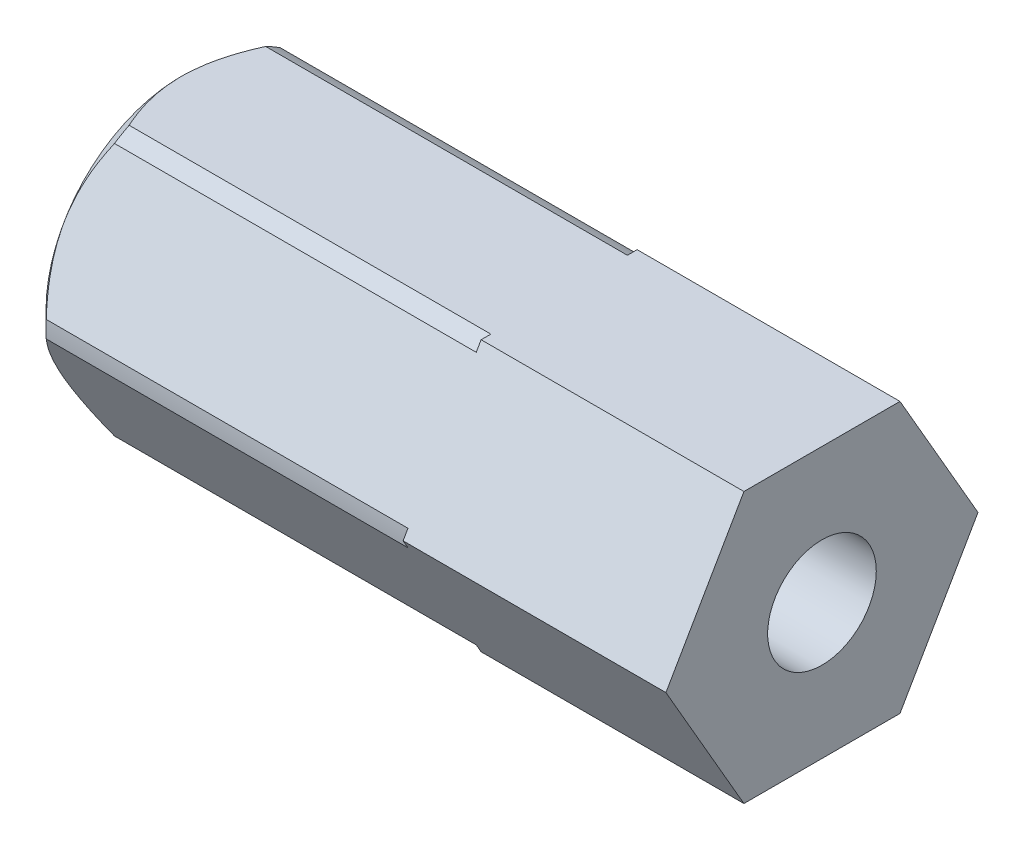
ISO-10303-21;
HEADER;
FILE_DESCRIPTION(('STEP AP214'),'2;1');
FILE_NAME('part.step','',(''),(''),'','','');
FILE_SCHEMA(('AUTOMOTIVE_DESIGN { 1 0 10303 214 1 1 1 1 }'));
ENDSEC;
DATA;
#1=APPLICATION_CONTEXT('core data for automotive mechanical design processes');
#2=APPLICATION_PROTOCOL_DEFINITION('international standard','automotive_design',2000,#1);
#3=PRODUCT_CONTEXT('',#1,'mechanical');
#4=PRODUCT('Part','Part','',(#3));
#5=PRODUCT_RELATED_PRODUCT_CATEGORY('part','',(#4));
#6=PRODUCT_DEFINITION_FORMATION('','',#4);
#7=PRODUCT_DEFINITION_CONTEXT('part definition',#1,'design');
#8=PRODUCT_DEFINITION('design','',#6,#7);
#9=PRODUCT_DEFINITION_SHAPE('','',#8);
#10=(LENGTH_UNIT() NAMED_UNIT(*) SI_UNIT(.MILLI.,.METRE.));
#11=(NAMED_UNIT(*) PLANE_ANGLE_UNIT() SI_UNIT($,.RADIAN.));
#12=(NAMED_UNIT(*) SI_UNIT($,.STERADIAN.) SOLID_ANGLE_UNIT());
#13=UNCERTAINTY_MEASURE_WITH_UNIT(LENGTH_MEASURE(1.E-05),#10,'distance_accuracy_value','');
#14=(GEOMETRIC_REPRESENTATION_CONTEXT(3) GLOBAL_UNCERTAINTY_ASSIGNED_CONTEXT((#13)) GLOBAL_UNIT_ASSIGNED_CONTEXT((#10,
#11,#12)) REPRESENTATION_CONTEXT('',''));
#15=CARTESIAN_POINT('',(0.,0.,0.));
#16=DIRECTION('',(0.,0.,1.));
#17=DIRECTION('',(1.,0.,0.));
#18=AXIS2_PLACEMENT_3D('',#15,#16,#17);
#19=CARTESIAN_POINT('',(-19.4400000000314,0.,0.));
#20=DIRECTION('',(-1.,0.,0.));
#21=DIRECTION('',(0.,0.,1.));
#22=AXIS2_PLACEMENT_3D('',#19,#20,#21);
#23=CONICAL_SURFACE('',#22,3.74999999996817,1.029744258673);
#24=CARTESIAN_POINT('',(-17.1867726786843,0.,5.6843418860808E-11));
#25=VERTEX_POINT('',#24);
#26=VERTEX_LOOP('',#25);
#27=FACE_BOUND('',#26,.T.);
#28=CARTESIAN_POINT('',(-19.44,0.,0.));
#29=DIRECTION('',(-1.,0.,0.));
#30=DIRECTION('',(0.,0.,1.));
#31=AXIS2_PLACEMENT_3D('',#28,#29,#30);
#32=CIRCLE('',#31,3.75);
#33=CARTESIAN_POINT('',(-19.44,0.,3.75));
#34=VERTEX_POINT('',#33);
#35=EDGE_CURVE('E236',#34,#34,#32,.T.);
#36=ORIENTED_EDGE('',*,*,#35,.T.);
#37=EDGE_LOOP('',(#36));
#38=FACE_BOUND('',#37,.T.);
#39=ADVANCED_FACE('F17',(#27,#38),#23,.F.);
#40=CARTESIAN_POINT('',(-27.94,0.,0.));
#41=DIRECTION('',(-1.,0.,0.));
#42=DIRECTION('',(0.,0.,1.));
#43=AXIS2_PLACEMENT_3D('',#40,#41,#42);
#44=CYLINDRICAL_SURFACE('',#43,3.75);
#45=ORIENTED_EDGE('',*,*,#35,.F.);
#46=EDGE_LOOP('',(#45));
#47=FACE_BOUND('',#46,.T.);
#48=CARTESIAN_POINT('',(-27.6900000000069,0.,0.));
#49=DIRECTION('',(-1.,0.,0.));
#50=DIRECTION('',(0.,-1.,0.));
#51=AXIS2_PLACEMENT_3D('',#48,#49,#50);
#52=CIRCLE('',#51,3.74999999996817);
#53=CARTESIAN_POINT('',(-27.6900000000069,-3.74999999996817,0.));
#54=VERTEX_POINT('',#53);
#55=EDGE_CURVE('E156',#54,#54,#52,.T.);
#56=ORIENTED_EDGE('',*,*,#55,.T.);
#57=EDGE_LOOP('',(#56));
#58=FACE_BOUND('',#57,.T.);
#59=ADVANCED_FACE('F339',(#47,#58),#44,.F.);
#60=CARTESIAN_POINT('',(-27.940000000001,0.,0.));
#61=DIRECTION('',(-1.,0.,0.));
#62=DIRECTION('',(0.,-1.,0.));
#63=AXIS2_PLACEMENT_3D('',#60,#61,#62);
#64=CONICAL_SURFACE('',#63,3.99999999996226,0.785398163397448);
#65=ORIENTED_EDGE('',*,*,#55,.F.);
#66=EDGE_LOOP('',(#65));
#67=FACE_BOUND('',#66,.T.);
#68=CARTESIAN_POINT('',(-27.940000000001,0.,0.));
#69=DIRECTION('',(-1.,0.,0.));
#70=DIRECTION('',(0.,-1.,0.));
#71=AXIS2_PLACEMENT_3D('',#68,#69,#70);
#72=CIRCLE('',#71,3.99999999996226);
#73=CARTESIAN_POINT('',(-27.940000000001,-3.99999999996226,0.));
#74=VERTEX_POINT('',#73);
#75=EDGE_CURVE('E220',#74,#74,#72,.T.);
#76=ORIENTED_EDGE('',*,*,#75,.T.);
#77=EDGE_LOOP('',(#76));
#78=FACE_BOUND('',#77,.T.);
#79=ADVANCED_FACE('F336',(#67,#78),#64,.F.);
#80=CARTESIAN_POINT('',(-10.5092499493935,0.,0.));
#81=DIRECTION('',(1.,0.,0.));
#82=DIRECTION('',(0.,0.,-1.));
#83=AXIS2_PLACEMENT_3D('',#80,#81,#82);
#84=CONICAL_SURFACE('',#83,2.55269999991015,1.02974425857637);
#85=CARTESIAN_POINT('',(-12.0430668516178,0.,-3.41060513164848E-10));
#86=VERTEX_POINT('',#85);
#87=VERTEX_LOOP('',#86);
#88=FACE_BOUND('',#87,.T.);
#89=CARTESIAN_POINT('',(-10.5092499493319,0.,0.));
#90=DIRECTION('',(1.,0.,0.));
#91=DIRECTION('',(0.,0.,-1.));
#92=AXIS2_PLACEMENT_3D('',#89,#90,#91);
#93=CIRCLE('',#92,2.55269999999999);
#94=CARTESIAN_POINT('',(-10.5092499493319,0.,-2.55269999999999));
#95=VERTEX_POINT('',#94);
#96=EDGE_CURVE('E192',#95,#95,#93,.T.);
#97=ORIENTED_EDGE('',*,*,#96,.T.);
#98=EDGE_LOOP('',(#97));
#99=FACE_BOUND('',#98,.T.);
#100=ADVANCED_FACE('F333',(#88,#99),#84,.F.);
#101=CARTESIAN_POINT('',(-10.16,0.,0.));
#102=DIRECTION('',(-1.,0.,0.));
#103=DIRECTION('',(0.,0.,1.));
#104=AXIS2_PLACEMENT_3D('',#101,#102,#103);
#105=PLANE('',#104);
#106=DIRECTION('',(0.,-0.866025403784439,-0.5));
#107=VECTOR('',#106,1.);
#108=CARTESIAN_POINT('',(-10.16,0.,-7.33234841870825));
#109=LINE('',#108,#107);
#110=CARTESIAN_POINT('',(-10.16,6.35000000000001,-3.66617420935411));
#111=VERTEX_POINT('',#110);
#112=CARTESIAN_POINT('',(-10.16,5.953125,-3.89531009743875));
#113=VERTEX_POINT('',#112);
#114=EDGE_CURVE('E150',#111,#113,#109,.T.);
#115=ORIENTED_EDGE('',*,*,#114,.T.);
#116=CARTESIAN_POINT('',(-10.16,0.,0.));
#117=DIRECTION('',(-1.,0.,0.));
#118=DIRECTION('',(0.,0.,1.));
#119=AXIS2_PLACEMENT_3D('',#116,#117,#118);
#120=CIRCLE('',#119,7.11429111161704);
#121=CARTESIAN_POINT('',(-10.16,6.35000000000001,-3.20790243318483));
#122=VERTEX_POINT('',#121);
#123=EDGE_CURVE('E20',#122,#113,#120,.T.);
#124=ORIENTED_EDGE('',*,*,#123,.F.);
#125=DIRECTION('',(0.,0.,-1.));
#126=VECTOR('',#125,1.);
#127=CARTESIAN_POINT('',(-10.16,6.35000000000001,-3.66617420935411));
#128=LINE('',#127,#126);
#129=EDGE_CURVE('E148',#122,#111,#128,.T.);
#130=ORIENTED_EDGE('',*,*,#129,.T.);
#131=EDGE_LOOP('',(#115,#124,#130));
#132=FACE_BOUND('',#131,.T.);
#133=ADVANCED_FACE('F147',(#132),#105,.T.);
#134=CARTESIAN_POINT('',(-10.16,0.,0.));
#135=DIRECTION('',(-1.,0.,0.));
#136=DIRECTION('',(0.,0.,1.));
#137=AXIS2_PLACEMENT_3D('',#134,#135,#136);
#138=CYLINDRICAL_SURFACE('',#137,7.11429111161704);
#139=DIRECTION('',(1.,0.,0.));
#140=VECTOR('',#139,1.);
#141=CARTESIAN_POINT('',(27.94,6.35000000000001,-3.20790243318483));
#142=LINE('',#141,#140);
#143=CARTESIAN_POINT('',(-27.1580573070912,6.35000000000001,-3.20790243318483));
#144=VERTEX_POINT('',#143);
#145=EDGE_CURVE('E162',#144,#122,#142,.T.);
#146=ORIENTED_EDGE('',*,*,#145,.T.);
#147=ORIENTED_EDGE('',*,*,#123,.T.);
#148=DIRECTION('',(1.,0.,0.));
#149=VECTOR('',#148,1.);
#150=CARTESIAN_POINT('',(27.94,5.953125,-3.89531009743875));
#151=LINE('',#150,#149);
#152=CARTESIAN_POINT('',(-27.1580573070912,5.953125,-3.89531009743875));
#153=VERTEX_POINT('',#152);
#154=EDGE_CURVE('E174',#113,#153,#151,.F.);
#155=ORIENTED_EDGE('',*,*,#154,.T.);
#156=CARTESIAN_POINT('',(-27.1580573070912,0.,0.));
#157=DIRECTION('',(1.,0.,0.));
#158=DIRECTION('',(0.,0.,-1.));
#159=AXIS2_PLACEMENT_3D('',#156,#157,#158);
#160=CIRCLE('',#159,7.11429111161704);
#161=EDGE_CURVE('E167',#144,#153,#160,.F.);
#162=ORIENTED_EDGE('',*,*,#161,.F.);
#163=EDGE_LOOP('',(#146,#147,#155,#162));
#164=FACE_BOUND('',#163,.T.);
#165=ADVANCED_FACE('F166',(#164),#138,.T.);
#166=CARTESIAN_POINT('',(-10.16,0.,0.));
#167=DIRECTION('',(-1.,0.,0.));
#168=DIRECTION('',(0.,0.,1.));
#169=AXIS2_PLACEMENT_3D('',#166,#167,#168);
#170=PLANE('',#169);
#171=DIRECTION('',(0.,-0.866025403784439,0.5));
#172=VECTOR('',#171,1.);
#173=CARTESIAN_POINT('',(-10.16,-6.35,-3.66617420935413));
#174=LINE('',#173,#172);
#175=CARTESIAN_POINT('',(-10.16,0.,-7.33234841870825));
#176=VERTEX_POINT('',#175);
#177=CARTESIAN_POINT('',(-10.16,-0.396875000000027,-7.10321253062361));
#178=VERTEX_POINT('',#177);
#179=EDGE_CURVE('E199',#176,#178,#174,.T.);
#180=ORIENTED_EDGE('',*,*,#179,.T.);
#181=CARTESIAN_POINT('',(-10.16,0.,0.));
#182=DIRECTION('',(-1.,0.,0.));
#183=DIRECTION('',(0.,0.,1.));
#184=AXIS2_PLACEMENT_3D('',#181,#182,#183);
#185=CIRCLE('',#184,7.11429111161704);
#186=CARTESIAN_POINT('',(-10.16,0.396874999999996,-7.10321253062361));
#187=VERTEX_POINT('',#186);
#188=EDGE_CURVE('E155',#187,#178,#185,.T.);
#189=ORIENTED_EDGE('',*,*,#188,.F.);
#190=DIRECTION('',(0.,-0.866025403784439,-0.5));
#191=VECTOR('',#190,1.);
#192=CARTESIAN_POINT('',(-10.16,0.,-7.33234841870825));
#193=LINE('',#192,#191);
#194=EDGE_CURVE('E206',#187,#176,#193,.T.);
#195=ORIENTED_EDGE('',*,*,#194,.T.);
#196=EDGE_LOOP('',(#180,#189,#195));
#197=FACE_BOUND('',#196,.T.);
#198=ADVANCED_FACE('F324',(#197),#170,.T.);
#199=CARTESIAN_POINT('',(-10.16,0.,0.));
#200=DIRECTION('',(-1.,0.,0.));
#201=DIRECTION('',(0.,0.,1.));
#202=AXIS2_PLACEMENT_3D('',#199,#200,#201);
#203=CYLINDRICAL_SURFACE('',#202,7.11429111161704);
#204=DIRECTION('',(1.,0.,0.));
#205=VECTOR('',#204,1.);
#206=CARTESIAN_POINT('',(27.94,0.396874999999996,-7.10321253062361));
#207=LINE('',#206,#205);
#208=CARTESIAN_POINT('',(-27.1580573070912,0.396874999999997,-7.10321253062361));
#209=VERTEX_POINT('',#208);
#210=EDGE_CURVE('E209',#209,#187,#207,.T.);
#211=ORIENTED_EDGE('',*,*,#210,.T.);
#212=ORIENTED_EDGE('',*,*,#188,.T.);
#213=DIRECTION('',(1.,0.,0.));
#214=VECTOR('',#213,1.);
#215=CARTESIAN_POINT('',(27.94,-0.396875000000026,-7.10321253062361));
#216=LINE('',#215,#214);
#217=CARTESIAN_POINT('',(-27.1580573070912,-0.396875000000027,-7.10321253062361));
#218=VERTEX_POINT('',#217);
#219=EDGE_CURVE('E202',#178,#218,#216,.F.);
#220=ORIENTED_EDGE('',*,*,#219,.T.);
#221=CARTESIAN_POINT('',(-27.1580573070912,0.,0.));
#222=DIRECTION('',(1.,0.,0.));
#223=DIRECTION('',(0.,0.,-1.));
#224=AXIS2_PLACEMENT_3D('',#221,#222,#223);
#225=CIRCLE('',#224,7.11429111161704);
#226=EDGE_CURVE('E198',#209,#218,#225,.F.);
#227=ORIENTED_EDGE('',*,*,#226,.F.);
#228=EDGE_LOOP('',(#211,#212,#220,#227));
#229=FACE_BOUND('',#228,.T.);
#230=ADVANCED_FACE('F320',(#229),#203,.T.);
#231=CARTESIAN_POINT('',(-27.94,0.,-7.33234841870825));
#232=DIRECTION('',(1.,0.,0.));
#233=DIRECTION('',(0.,0.,-1.));
#234=AXIS2_PLACEMENT_3D('',#231,#232,#233);
#235=PLANE('',#234);
#236=CARTESIAN_POINT('',(-27.94,0.,0.));
#237=DIRECTION('',(1.,0.,0.));
#238=DIRECTION('',(0.,0.,-1.));
#239=AXIS2_PLACEMENT_3D('',#236,#237,#238);
#240=CIRCLE('',#239,6.33234841870825);
#241=CARTESIAN_POINT('',(-27.94,0.,-6.33234841870825));
#242=VERTEX_POINT('',#241);
#243=EDGE_CURVE('E447',#242,#242,#240,.T.);
#244=ORIENTED_EDGE('',*,*,#243,.F.);
#245=EDGE_LOOP('',(#244));
#246=FACE_BOUND('',#245,.T.);
#247=ORIENTED_EDGE('',*,*,#75,.F.);
#248=EDGE_LOOP('',(#247));
#249=FACE_BOUND('',#248,.T.);
#250=ADVANCED_FACE('F316',(#246,#249),#235,.F.);
#251=CARTESIAN_POINT('',(-10.16,0.,0.));
#252=DIRECTION('',(-1.,0.,0.));
#253=DIRECTION('',(0.,0.,1.));
#254=AXIS2_PLACEMENT_3D('',#251,#252,#253);
#255=CYLINDRICAL_SURFACE('',#254,7.11429111161704);
#256=DIRECTION('',(1.,0.,0.));
#257=VECTOR('',#256,1.);
#258=CARTESIAN_POINT('',(27.94,5.95312499999998,3.89531009743878));
#259=LINE('',#258,#257);
#260=CARTESIAN_POINT('',(-27.1580573070912,5.95312499999998,3.89531009743878));
#261=VERTEX_POINT('',#260);
#262=CARTESIAN_POINT('',(-10.16,5.95312499999998,3.89531009743878));
#263=VERTEX_POINT('',#262);
#264=EDGE_CURVE('E183',#261,#263,#259,.T.);
#265=ORIENTED_EDGE('',*,*,#264,.T.);
#266=CARTESIAN_POINT('',(-10.16,0.,0.));
#267=DIRECTION('',(-1.,0.,0.));
#268=DIRECTION('',(0.,0.,1.));
#269=AXIS2_PLACEMENT_3D('',#266,#267,#268);
#270=CIRCLE('',#269,7.11429111161704);
#271=CARTESIAN_POINT('',(-10.16,6.35000000000001,3.20790243318484));
#272=VERTEX_POINT('',#271);
#273=EDGE_CURVE('E197',#272,#263,#270,.F.);
#274=ORIENTED_EDGE('',*,*,#273,.F.);
#275=DIRECTION('',(1.,0.,0.));
#276=VECTOR('',#275,1.);
#277=CARTESIAN_POINT('',(27.94,6.35000000000001,3.20790243318484));
#278=LINE('',#277,#276);
#279=CARTESIAN_POINT('',(-27.1580573070912,6.35000000000001,3.20790243318483));
#280=VERTEX_POINT('',#279);
#281=EDGE_CURVE('E170',#272,#280,#278,.F.);
#282=ORIENTED_EDGE('',*,*,#281,.T.);
#283=CARTESIAN_POINT('',(-27.1580573070912,0.,0.));
#284=DIRECTION('',(-1.,0.,0.));
#285=DIRECTION('',(0.,0.,1.));
#286=AXIS2_PLACEMENT_3D('',#283,#284,#285);
#287=CIRCLE('',#286,7.11429111161704);
#288=EDGE_CURVE('E195',#280,#261,#287,.F.);
#289=ORIENTED_EDGE('',*,*,#288,.T.);
#290=EDGE_LOOP('',(#265,#274,#282,#289));
#291=FACE_BOUND('',#290,.T.);
#292=ADVANCED_FACE('F312',(#291),#255,.T.);
#293=CARTESIAN_POINT('',(-10.16,0.,0.));
#294=DIRECTION('',(-1.,0.,0.));
#295=DIRECTION('',(0.,0.,1.));
#296=AXIS2_PLACEMENT_3D('',#293,#294,#295);
#297=PLANE('',#296);
#298=DIRECTION('',(0.,0.,-1.));
#299=VECTOR('',#298,1.);
#300=CARTESIAN_POINT('',(-10.16,6.35000000000001,-3.66617420935411));
#301=LINE('',#300,#299);
#302=CARTESIAN_POINT('',(-10.16,6.35,3.66617420935413));
#303=VERTEX_POINT('',#302);
#304=EDGE_CURVE('E178',#303,#272,#301,.T.);
#305=ORIENTED_EDGE('',*,*,#304,.T.);
#306=ORIENTED_EDGE('',*,*,#273,.T.);
#307=DIRECTION('',(0.,0.866025403784439,-0.5));
#308=VECTOR('',#307,1.);
#309=CARTESIAN_POINT('',(-10.16,6.35000000000001,3.66617420935413));
#310=LINE('',#309,#308);
#311=EDGE_CURVE('E179',#263,#303,#310,.T.);
#312=ORIENTED_EDGE('',*,*,#311,.T.);
#313=EDGE_LOOP('',(#305,#306,#312));
#314=FACE_BOUND('',#313,.T.);
#315=ADVANCED_FACE('F308',(#314),#297,.T.);
#316=CARTESIAN_POINT('',(2.19075005066805,0.,0.));
#317=DIRECTION('',(1.,0.,0.));
#318=DIRECTION('',(0.,0.,-1.));
#319=AXIS2_PLACEMENT_3D('',#316,#317,#318);
#320=CYLINDRICAL_SURFACE('',#319,2.55269999999999);
#321=ORIENTED_EDGE('',*,*,#96,.F.);
#322=EDGE_LOOP('',(#321));
#323=FACE_BOUND('',#322,.T.);
#324=CARTESIAN_POINT('',(2.19075005066805,0.,0.));
#325=DIRECTION('',(1.,0.,0.));
#326=DIRECTION('',(0.,0.,-1.));
#327=AXIS2_PLACEMENT_3D('',#324,#325,#326);
#328=CIRCLE('',#327,2.55269999999999);
#329=CARTESIAN_POINT('',(2.19075005066805,0.,-2.55269999999999));
#330=VERTEX_POINT('',#329);
#331=EDGE_CURVE('E187',#330,#330,#328,.T.);
#332=ORIENTED_EDGE('',*,*,#331,.T.);
#333=EDGE_LOOP('',(#332));
#334=FACE_BOUND('',#333,.T.);
#335=ADVANCED_FACE('F303',(#323,#334),#320,.F.);
#336=CARTESIAN_POINT('',(27.94,6.35000000000001,-3.66617420935411));
#337=DIRECTION('',(0.,-1.,0.));
#338=DIRECTION('',(0.,0.,-1.));
#339=AXIS2_PLACEMENT_3D('',#336,#337,#338);
#340=PLANE('',#339);
#341=DIRECTION('',(0.,0.,1.));
#342=VECTOR('',#341,1.);
#343=CARTESIAN_POINT('',(2.19075005066806,6.35,12.5758362300965));
#344=LINE('',#343,#342);
#345=CARTESIAN_POINT('',(2.19075005066805,6.35,3.66617420935413));
#346=VERTEX_POINT('',#345);
#347=CARTESIAN_POINT('',(2.19075005066805,6.35,-3.66617420935411));
#348=VERTEX_POINT('',#347);
#349=EDGE_CURVE('E473',#346,#348,#344,.F.);
#350=ORIENTED_EDGE('',*,*,#349,.T.);
#351=DIRECTION('',(1.,0.,0.));
#352=VECTOR('',#351,1.);
#353=CARTESIAN_POINT('',(27.94,6.35000000000001,-3.66617420935411));
#354=LINE('',#353,#352);
#355=EDGE_CURVE('E164',#348,#111,#354,.F.);
#356=ORIENTED_EDGE('',*,*,#355,.T.);
#357=ORIENTED_EDGE('',*,*,#129,.F.);
#358=ORIENTED_EDGE('',*,*,#145,.F.);
#359=CARTESIAN_POINT('',(-27.1580573070912,6.35000000000001,3.20790243318483));
#360=CARTESIAN_POINT('',(-27.2605767859386,6.35000000000001,2.98047910617317));
#361=CARTESIAN_POINT('',(-27.3560634822946,6.35000000000001,2.74952060659248));
#362=CARTESIAN_POINT('',(-27.5289975142601,6.35000000000001,2.27995777339668));
#363=CARTESIAN_POINT('',(-27.6063717438926,6.35000000000001,2.04132673064696));
#364=CARTESIAN_POINT('',(-27.7374138228901,6.35000000000001,1.56062687574978));
#365=CARTESIAN_POINT('',(-27.7913613794336,6.35000000000001,1.3186363758131));
#366=CARTESIAN_POINT('',(-27.8727704382509,6.35000000000001,0.830539227757479));
#367=CARTESIAN_POINT('',(-27.9002751973628,6.35000000000001,0.584439974411742));
#368=CARTESIAN_POINT('',(-27.9255318922882,6.35000000000001,0.108724844914567));
#369=CARTESIAN_POINT('',(-27.9253092871103,6.35000000000001,-0.120782797597069));
#370=CARTESIAN_POINT('',(-27.9001484692461,6.35000000000001,-0.57853317737382));
#371=CARTESIAN_POINT('',(-27.8751973952962,6.35000000000001,-0.806775194269131));
#372=CARTESIAN_POINT('',(-27.8025082644535,6.35000000000001,-1.25949244361481));
#373=CARTESIAN_POINT('',(-27.7547724613027,6.35000000000001,-1.48396804634569));
#374=CARTESIAN_POINT('',(-27.6396266240431,6.35000000000001,-1.92782488711224));
#375=CARTESIAN_POINT('',(-27.5722092437077,6.35000000000001,-2.14720418986588));
#376=CARTESIAN_POINT('',(-27.446649516595,6.35000000000001,-2.50714343960539));
#377=CARTESIAN_POINT('',(-27.3930507002611,6.35000000000001,-2.64932657908124));
#378=CARTESIAN_POINT('',(-27.279849216285,6.35000000000001,-2.93070481373835));
#379=CARTESIAN_POINT('',(-27.2202684610679,6.35000000000001,-3.06990870081327));
#380=CARTESIAN_POINT('',(-27.1580573070912,6.35000000000001,-3.20790243318483));
#381=B_SPLINE_CURVE_WITH_KNOTS('',3,(#359,#360,#361,#362,#363,#364,#365,#366,#367,#368,#369,
#370,#371,#372,#373,#374,#375,#376,#377,#378,#379,#380),.UNSPECIFIED.,.F.,.F.,(4,2,2,2,2,2,2,2,
2,2,4),(0.,0.748771267531359,1.50051454987211,2.24301743560472,2.98430360984528,
3.67147371103992,4.35900139669901,5.04646108993245,5.73417770900334,6.18989262281579,
6.64399522590267),.UNSPECIFIED.);
#382=EDGE_CURVE('E168',#280,#144,#381,.T.);
#383=ORIENTED_EDGE('',*,*,#382,.F.);
#384=ORIENTED_EDGE('',*,*,#281,.F.);
#385=ORIENTED_EDGE('',*,*,#304,.F.);
#386=DIRECTION('',(1.,0.,0.));
#387=VECTOR('',#386,1.);
#388=CARTESIAN_POINT('',(27.94,6.35,3.66617420935413));
#389=LINE('',#388,#387);
#390=EDGE_CURVE('E182',#303,#346,#389,.T.);
#391=ORIENTED_EDGE('',*,*,#390,.T.);
#392=EDGE_LOOP('',(#350,#356,#357,#358,#383,#384,#385,#391));
#393=FACE_BOUND('',#392,.T.);
#394=ADVANCED_FACE('F160',(#393),#340,.F.);
#395=CARTESIAN_POINT('',(27.94,0.,-7.33234841870825));
#396=DIRECTION('',(0.,-0.5,0.866025403784439));
#397=DIRECTION('',(0.,-0.866025403784439,-0.5));
#398=AXIS2_PLACEMENT_3D('',#395,#396,#397);
#399=PLANE('',#398);
#400=DIRECTION('',(0.,-0.866025403784438,-0.5));
#401=VECTOR('',#400,1.);
#402=CARTESIAN_POINT('',(2.19075005066805,6.35000000000001,-3.66617420935411));
#403=LINE('',#402,#401);
#404=CARTESIAN_POINT('',(2.19075005066805,0.,-7.33234841870825));
#405=VERTEX_POINT('',#404);
#406=EDGE_CURVE('E418',#348,#405,#403,.T.);
#407=ORIENTED_EDGE('',*,*,#406,.T.);
#408=DIRECTION('',(1.,0.,0.));
#409=VECTOR('',#408,1.);
#410=CARTESIAN_POINT('',(27.94,0.,-7.33234841870825));
#411=LINE('',#410,#409);
#412=EDGE_CURVE('E212',#405,#176,#411,.F.);
#413=ORIENTED_EDGE('',*,*,#412,.T.);
#414=ORIENTED_EDGE('',*,*,#194,.F.);
#415=ORIENTED_EDGE('',*,*,#210,.F.);
#416=CARTESIAN_POINT('',(-27.1580573070912,5.95312499999999,-3.89531009743875));
#417=CARTESIAN_POINT('',(-27.2605767859386,5.75617062139472,-4.00902176094458));
#418=CARTESIAN_POINT('',(-27.3560634822946,5.55615469353791,-4.12450101073493));
#419=CARTESIAN_POINT('',(-27.5289975142601,5.14950135131735,-4.35928242733283));
#420=CARTESIAN_POINT('',(-27.6063717438926,4.94284080616451,-4.47859794870769));
#421=CARTESIAN_POINT('',(-27.7374138228901,4.52654252022806,-4.71894787615628));
#422=CARTESIAN_POINT('',(-27.7913613794336,4.31697259980839,-4.83994312612462));
#423=CARTESIAN_POINT('',(-27.8727704382509,3.89426807007749,-5.08399170015243));
#424=CARTESIAN_POINT('',(-27.9002751973629,3.6811398648277,-5.2070413268253));
#425=CARTESIAN_POINT('',(-27.9255318922882,3.26915847771854,-5.44489889157389));
#426=CARTESIAN_POINT('',(-27.9253092871103,3.07039902894079,-5.55965271282971));
#427=CARTESIAN_POINT('',(-27.9001484692461,2.67397557146215,-5.78852790271809));
#428=CARTESIAN_POINT('',(-27.8751973952962,2.47631218661981,-5.90264891116574));
#429=CARTESIAN_POINT('',(-27.8025082644535,2.08424754795504,-6.12900753583858));
#430=CARTESIAN_POINT('',(-27.7547724613028,1.88984597346027,-6.24124533720402));
#431=CARTESIAN_POINT('',(-27.6396266240431,1.50545467371294,-6.4631737575873));
#432=CARTESIAN_POINT('',(-27.5722092437077,1.31546662446377,-6.57286340896411));
#433=CARTESIAN_POINT('',(-27.446649516595,1.00375009037023,-6.75283303383388));
#434=CARTESIAN_POINT('',(-27.3930507002611,0.880615879594312,-6.8239246035718));
#435=CARTESIAN_POINT('',(-27.279849216285,0.636935180309227,-6.96461372090036));
#436=CARTESIAN_POINT('',(-27.2202684610679,0.516381077796808,-7.03421566443782));
#437=CARTESIAN_POINT('',(-27.1580573070912,0.396874999999998,-7.10321253062361));
#438=B_SPLINE_CURVE_WITH_KNOTS('',3,(#416,#417,#418,#419,#420,#421,#422,#423,#424,#425,#426,
#427,#428,#429,#430,#431,#432,#433,#434,#435,#436,#437),.UNSPECIFIED.,.F.,.F.,(4,2,2,2,2,2,2,2,
2,2,4),(0.,0.748771267531362,1.50051454987212,2.24301743560473,2.98430360984529,
3.67147371103993,4.35900139669903,5.04646108993247,5.73417770900336,6.18989262281582,
6.64399522590272),.UNSPECIFIED.);
#439=EDGE_CURVE('E287',#153,#209,#438,.T.);
#440=ORIENTED_EDGE('',*,*,#439,.F.);
#441=ORIENTED_EDGE('',*,*,#154,.F.);
#442=ORIENTED_EDGE('',*,*,#114,.F.);
#443=ORIENTED_EDGE('',*,*,#355,.F.);
#444=EDGE_LOOP('',(#407,#413,#414,#415,#440,#441,#442,#443));
#445=FACE_BOUND('',#444,.T.);
#446=ADVANCED_FACE('F302',(#445),#399,.F.);
#447=CARTESIAN_POINT('',(-10.16,0.,0.));
#448=DIRECTION('',(-1.,0.,0.));
#449=DIRECTION('',(0.,0.,1.));
#450=AXIS2_PLACEMENT_3D('',#447,#448,#449);
#451=PLANE('',#450);
#452=DIRECTION('',(0.,-0.866025403784439,0.5));
#453=VECTOR('',#452,1.);
#454=CARTESIAN_POINT('',(-10.16,-6.35,-3.66617420935413));
#455=LINE('',#454,#453);
#456=CARTESIAN_POINT('',(-10.16,-5.95312499999998,-3.89531009743878));
#457=VERTEX_POINT('',#456);
#458=CARTESIAN_POINT('',(-10.16,-6.35,-3.66617420935413));
#459=VERTEX_POINT('',#458);
#460=EDGE_CURVE('E216',#457,#459,#455,.T.);
#461=ORIENTED_EDGE('',*,*,#460,.T.);
#462=DIRECTION('',(0.,0.,1.));
#463=VECTOR('',#462,1.);
#464=CARTESIAN_POINT('',(-10.16,-6.35,3.66617420935413));
#465=LINE('',#464,#463);
#466=CARTESIAN_POINT('',(-10.16,-6.35,-3.20790243318485));
#467=VERTEX_POINT('',#466);
#468=EDGE_CURVE('E414',#459,#467,#465,.T.);
#469=ORIENTED_EDGE('',*,*,#468,.T.);
#470=CARTESIAN_POINT('',(-10.16,0.,0.));
#471=DIRECTION('',(-1.,0.,0.));
#472=DIRECTION('',(0.,0.,1.));
#473=AXIS2_PLACEMENT_3D('',#470,#471,#472);
#474=CIRCLE('',#473,7.11429111161704);
#475=EDGE_CURVE('E203',#457,#467,#474,.T.);
#476=ORIENTED_EDGE('',*,*,#475,.F.);
#477=EDGE_LOOP('',(#461,#469,#476));
#478=FACE_BOUND('',#477,.T.);
#479=ADVANCED_FACE('F460',(#478),#451,.T.);
#480=CARTESIAN_POINT('',(-10.16,0.,0.));
#481=DIRECTION('',(-1.,0.,0.));
#482=DIRECTION('',(0.,0.,1.));
#483=AXIS2_PLACEMENT_3D('',#480,#481,#482);
#484=CYLINDRICAL_SURFACE('',#483,7.11429111161704);
#485=DIRECTION('',(1.,0.,0.));
#486=VECTOR('',#485,1.);
#487=CARTESIAN_POINT('',(27.94,-6.35,-3.20790243318485));
#488=LINE('',#487,#486);
#489=CARTESIAN_POINT('',(-27.1580573070912,-6.35,-3.20790243318485));
#490=VERTEX_POINT('',#489);
#491=EDGE_CURVE('E417',#467,#490,#488,.F.);
#492=ORIENTED_EDGE('',*,*,#491,.T.);
#493=CARTESIAN_POINT('',(-27.1580573070912,0.,0.));
#494=DIRECTION('',(1.,0.,0.));
#495=DIRECTION('',(0.,0.,-1.));
#496=AXIS2_PLACEMENT_3D('',#493,#494,#495);
#497=CIRCLE('',#496,7.11429111161704);
#498=CARTESIAN_POINT('',(-27.1580573070912,-5.95312499999998,-3.89531009743878));
#499=VERTEX_POINT('',#498);
#500=EDGE_CURVE('E393',#499,#490,#497,.F.);
#501=ORIENTED_EDGE('',*,*,#500,.F.);
#502=DIRECTION('',(1.,0.,0.));
#503=VECTOR('',#502,1.);
#504=CARTESIAN_POINT('',(27.94,-5.95312499999998,-3.89531009743878));
#505=LINE('',#504,#503);
#506=EDGE_CURVE('E408',#499,#457,#505,.T.);
#507=ORIENTED_EDGE('',*,*,#506,.T.);
#508=ORIENTED_EDGE('',*,*,#475,.T.);
#509=EDGE_LOOP('',(#492,#501,#507,#508));
#510=FACE_BOUND('',#509,.T.);
#511=ADVANCED_FACE('F454',(#510),#484,.T.);
#512=CARTESIAN_POINT('',(27.94,-6.35,-3.66617420935413));
#513=DIRECTION('',(0.,0.5,0.866025403784439));
#514=DIRECTION('',(0.,-0.866025403784439,0.5));
#515=AXIS2_PLACEMENT_3D('',#512,#513,#514);
#516=PLANE('',#515);
#517=DIRECTION('',(0.,-0.866025403784438,0.500000000000001));
#518=VECTOR('',#517,1.);
#519=CARTESIAN_POINT('',(2.19075005066805,0.,-7.33234841870825));
#520=LINE('',#519,#518);
#521=CARTESIAN_POINT('',(2.19075005066805,-6.35,-3.66617420935413));
#522=VERTEX_POINT('',#521);
#523=EDGE_CURVE('E462',#405,#522,#520,.T.);
#524=ORIENTED_EDGE('',*,*,#523,.T.);
#525=DIRECTION('',(1.,0.,0.));
#526=VECTOR('',#525,1.);
#527=CARTESIAN_POINT('',(27.94,-6.35,-3.66617420935413));
#528=LINE('',#527,#526);
#529=EDGE_CURVE('E397',#522,#459,#528,.F.);
#530=ORIENTED_EDGE('',*,*,#529,.T.);
#531=ORIENTED_EDGE('',*,*,#460,.F.);
#532=ORIENTED_EDGE('',*,*,#506,.F.);
#533=CARTESIAN_POINT('',(-27.1580573070912,-0.396875000000037,-7.1032125306236));
#534=CARTESIAN_POINT('',(-27.2605767859386,-0.593829378605308,-6.98950086711777));
#535=CARTESIAN_POINT('',(-27.3560634822946,-0.793845306462121,-6.87402161732743));
#536=CARTESIAN_POINT('',(-27.5289975142601,-1.20049864868268,-6.63924020072953));
#537=CARTESIAN_POINT('',(-27.6063717438926,-1.40715919383551,-6.51992467935467));
#538=CARTESIAN_POINT('',(-27.7374138228901,-1.82345747977196,-6.27957475190608));
#539=CARTESIAN_POINT('',(-27.7913613794336,-2.03302740019162,-6.15857950193774));
#540=CARTESIAN_POINT('',(-27.8727704382509,-2.45573192992252,-5.91453092790993));
#541=CARTESIAN_POINT('',(-27.9002751973628,-2.66886013517231,-5.79148130123706));
#542=CARTESIAN_POINT('',(-27.9255318922882,-3.08084152228147,-5.55362373648847));
#543=CARTESIAN_POINT('',(-27.9253092871103,-3.27960097105922,-5.43886991523266));
#544=CARTESIAN_POINT('',(-27.9001484692461,-3.67602442853786,-5.20999472534428));
#545=CARTESIAN_POINT('',(-27.8751973952962,-3.8736878133802,-5.09587371689662));
#546=CARTESIAN_POINT('',(-27.8025082644535,-4.26575245204497,-4.86951509222378));
#547=CARTESIAN_POINT('',(-27.7547724613027,-4.46015402653974,-4.75727729085835));
#548=CARTESIAN_POINT('',(-27.6396266240431,-4.84454532628707,-4.53534887047507));
#549=CARTESIAN_POINT('',(-27.5722092437077,-5.03453337553624,-4.42565921909825));
#550=CARTESIAN_POINT('',(-27.446649516595,-5.34624990962977,-4.24568959422849));
#551=CARTESIAN_POINT('',(-27.3930507002611,-5.46938412040568,-4.17459802449057));
#552=CARTESIAN_POINT('',(-27.279849216285,-5.71306481969076,-4.03390890716201));
#553=CARTESIAN_POINT('',(-27.2202684610679,-5.83361892220317,-3.96430696362456));
#554=CARTESIAN_POINT('',(-27.1580573070912,-5.95312499999998,-3.89531009743878));
#555=B_SPLINE_CURVE_WITH_KNOTS('',3,(#533,#534,#535,#536,#537,#538,#539,#540,#541,#542,#543,
#544,#545,#546,#547,#548,#549,#550,#551,#552,#553,#554),.UNSPECIFIED.,.F.,.F.,(4,2,2,2,2,2,2,2,
2,2,4),(0.,0.748771267531356,1.50051454987211,2.24301743560471,2.98430360984527,
3.67147371103991,4.359001396699,5.04646108993244,5.73417770900333,6.18989262281577,
6.64399522590266),.UNSPECIFIED.);
#556=EDGE_CURVE('E270',#218,#499,#555,.T.);
#557=ORIENTED_EDGE('',*,*,#556,.F.);
#558=ORIENTED_EDGE('',*,*,#219,.F.);
#559=ORIENTED_EDGE('',*,*,#179,.F.);
#560=ORIENTED_EDGE('',*,*,#412,.F.);
#561=EDGE_LOOP('',(#524,#530,#531,#532,#557,#558,#559,#560));
#562=FACE_BOUND('',#561,.T.);
#563=ADVANCED_FACE('F443',(#562),#516,.F.);
#564=CARTESIAN_POINT('',(-10.16,0.,0.));
#565=DIRECTION('',(-1.,0.,0.));
#566=DIRECTION('',(0.,0.,1.));
#567=AXIS2_PLACEMENT_3D('',#564,#565,#566);
#568=PLANE('',#567);
#569=DIRECTION('',(0.,0.866025403784438,0.500000000000001));
#570=VECTOR('',#569,1.);
#571=CARTESIAN_POINT('',(-10.16,0.,7.33234841870825));
#572=LINE('',#571,#570);
#573=CARTESIAN_POINT('',(-10.16,-6.35,3.66617420935413));
#574=VERTEX_POINT('',#573);
#575=CARTESIAN_POINT('',(-10.16,-5.95312499999999,3.89531009743877));
#576=VERTEX_POINT('',#575);
#577=EDGE_CURVE('E394',#574,#576,#572,.T.);
#578=ORIENTED_EDGE('',*,*,#577,.T.);
#579=CARTESIAN_POINT('',(-10.16,0.,0.));
#580=DIRECTION('',(-1.,0.,0.));
#581=DIRECTION('',(0.,0.,1.));
#582=AXIS2_PLACEMENT_3D('',#579,#580,#581);
#583=CIRCLE('',#582,7.11429111161704);
#584=CARTESIAN_POINT('',(-10.16,-6.35,3.20790243318485));
#585=VERTEX_POINT('',#584);
#586=EDGE_CURVE('E215',#585,#576,#583,.T.);
#587=ORIENTED_EDGE('',*,*,#586,.F.);
#588=DIRECTION('',(0.,0.,1.));
#589=VECTOR('',#588,1.);
#590=CARTESIAN_POINT('',(-10.16,-6.35,3.66617420935413));
#591=LINE('',#590,#589);
#592=EDGE_CURVE('E400',#585,#574,#591,.T.);
#593=ORIENTED_EDGE('',*,*,#592,.T.);
#594=EDGE_LOOP('',(#578,#587,#593));
#595=FACE_BOUND('',#594,.T.);
#596=ADVANCED_FACE('F562',(#595),#568,.T.);
#597=CARTESIAN_POINT('',(-10.16,0.,0.));
#598=DIRECTION('',(-1.,0.,0.));
#599=DIRECTION('',(0.,0.,1.));
#600=AXIS2_PLACEMENT_3D('',#597,#598,#599);
#601=CYLINDRICAL_SURFACE('',#600,7.11429111161704);
#602=DIRECTION('',(1.,0.,0.));
#603=VECTOR('',#602,1.);
#604=CARTESIAN_POINT('',(27.94,-6.35,3.20790243318485));
#605=LINE('',#604,#603);
#606=CARTESIAN_POINT('',(-27.1580573070912,-6.35,3.20790243318485));
#607=VERTEX_POINT('',#606);
#608=EDGE_CURVE('E403',#607,#585,#605,.T.);
#609=ORIENTED_EDGE('',*,*,#608,.T.);
#610=ORIENTED_EDGE('',*,*,#586,.T.);
#611=DIRECTION('',(1.,0.,0.));
#612=VECTOR('',#611,1.);
#613=CARTESIAN_POINT('',(27.94,-5.95312499999999,3.89531009743876));
#614=LINE('',#613,#612);
#615=CARTESIAN_POINT('',(-27.1580573070912,-5.95312500000005,3.89531009743873));
#616=VERTEX_POINT('',#615);
#617=EDGE_CURVE('E248',#576,#616,#614,.F.);
#618=ORIENTED_EDGE('',*,*,#617,.T.);
#619=CARTESIAN_POINT('',(-27.1580573070912,0.,0.));
#620=DIRECTION('',(1.,0.,0.));
#621=DIRECTION('',(0.,0.,-1.));
#622=AXIS2_PLACEMENT_3D('',#619,#620,#621);
#623=CIRCLE('',#622,7.11429111161704);
#624=EDGE_CURVE('E389',#607,#616,#623,.F.);
#625=ORIENTED_EDGE('',*,*,#624,.F.);
#626=EDGE_LOOP('',(#609,#610,#618,#625));
#627=FACE_BOUND('',#626,.T.);
#628=ADVANCED_FACE('F263',(#627),#601,.T.);
#629=CARTESIAN_POINT('',(-27.1580573070911,0.,0.));
#630=DIRECTION('',(1.,0.,0.));
#631=DIRECTION('',(0.,0.,-1.));
#632=AXIS2_PLACEMENT_3D('',#629,#630,#631);
#633=CONICAL_SURFACE('',#632,7.11429111161712,0.785398163397441);
#634=ORIENTED_EDGE('',*,*,#243,.T.);
#635=EDGE_LOOP('',(#634));
#636=FACE_BOUND('',#635,.T.);
#637=CARTESIAN_POINT('',(-27.1580573070911,-5.95312500000011,3.89531009743869));
#638=CARTESIAN_POINT('',(-27.2605767859386,-5.75617062139483,4.00902176094453));
#639=CARTESIAN_POINT('',(-27.3560634822946,-5.55615469353801,4.12450101073487));
#640=CARTESIAN_POINT('',(-27.5289975142601,-5.14950135131744,4.35928242733278));
#641=CARTESIAN_POINT('',(-27.6063717438925,-4.9428408061646,4.47859794870765));
#642=CARTESIAN_POINT('',(-27.7374138228901,-4.52654252022814,4.71894787615625));
#643=CARTESIAN_POINT('',(-27.7913613794336,-4.31697259980847,4.83994312612459));
#644=CARTESIAN_POINT('',(-27.8727704382509,-3.89426807007755,5.08399170015241));
#645=CARTESIAN_POINT('',(-27.9002751973628,-3.68113986482776,5.20704132682528));
#646=CARTESIAN_POINT('',(-27.9255318922882,-3.26915847771858,5.44489889157388));
#647=CARTESIAN_POINT('',(-27.9253092871103,-3.07039902894083,5.5596527128297));
#648=CARTESIAN_POINT('',(-27.9001484692461,-2.67397557146218,5.78852790271808));
#649=CARTESIAN_POINT('',(-27.8751973952962,-2.47631218661983,5.90264891116574));
#650=CARTESIAN_POINT('',(-27.8025082644535,-2.08424754795505,6.12900753583859));
#651=CARTESIAN_POINT('',(-27.7547724613027,-1.88984597346028,6.24124533720403));
#652=CARTESIAN_POINT('',(-27.6396266240431,-1.50545467371294,6.46317375758731));
#653=CARTESIAN_POINT('',(-27.5722092437077,-1.31546662446377,6.57286340896413));
#654=CARTESIAN_POINT('',(-27.446649516595,-1.00375009037023,6.75283303383389));
#655=CARTESIAN_POINT('',(-27.3930507002611,-0.880615879594321,6.82392460357181));
#656=CARTESIAN_POINT('',(-27.279849216285,-0.636935180309249,6.96461372090037));
#657=CARTESIAN_POINT('',(-27.2202684610679,-0.516381077796836,7.03421566443782));
#658=CARTESIAN_POINT('',(-27.1580573070912,-0.396875000000033,7.1032125306236));
#659=B_SPLINE_CURVE_WITH_KNOTS('',3,(#637,#638,#639,#640,#641,#642,#643,#644,#645,#646,#647,
#648,#649,#650,#651,#652,#653,#654,#655,#656,#657,#658),.UNSPECIFIED.,.F.,.F.,(4,2,2,2,2,2,2,2,
2,2,4),(0.,0.748771267531388,1.50051454987217,2.24301743560481,2.98430360984539,
3.67147371104005,4.35900139669916,5.04646108993261,5.73417770900351,6.18989262281596,
6.64399522590283),.UNSPECIFIED.);
#660=CARTESIAN_POINT('',(-27.1580573070912,-0.396875000000024,7.10321253062361));
#661=VERTEX_POINT('',#660);
#662=EDGE_CURVE('E239',#616,#661,#659,.T.);
#663=ORIENTED_EDGE('',*,*,#662,.T.);
#664=CARTESIAN_POINT('',(-27.1580573070912,0.,0.));
#665=DIRECTION('',(-1.,0.,0.));
#666=DIRECTION('',(0.,0.,1.));
#667=AXIS2_PLACEMENT_3D('',#664,#665,#666);
#668=CIRCLE('',#667,7.11429111161704);
#669=CARTESIAN_POINT('',(-27.1580573070912,0.396874999999966,7.10321253062364));
#670=VERTEX_POINT('',#669);
#671=EDGE_CURVE('E387',#670,#661,#668,.F.);
#672=ORIENTED_EDGE('',*,*,#671,.F.);
#673=CARTESIAN_POINT('',(-27.1580573070911,0.396874999999902,7.10321253062368));
#674=CARTESIAN_POINT('',(-27.2605767859386,0.593829378605181,6.98950086711784));
#675=CARTESIAN_POINT('',(-27.3560634822946,0.793845306462001,6.8740216173275));
#676=CARTESIAN_POINT('',(-27.5289975142601,1.20049864868257,6.63924020072959));
#677=CARTESIAN_POINT('',(-27.6063717438925,1.40715919383541,6.51992467935472));
#678=CARTESIAN_POINT('',(-27.7374138228901,1.82345747977187,6.27957475190613));
#679=CARTESIAN_POINT('',(-27.7913613794335,2.03302740019154,6.15857950193778));
#680=CARTESIAN_POINT('',(-27.8727704382509,2.45573192992246,5.91453092790996));
#681=CARTESIAN_POINT('',(-27.9002751973628,2.66886013517225,5.79148130123709));
#682=CARTESIAN_POINT('',(-27.9255318922882,3.08084152228142,5.5536237364885));
#683=CARTESIAN_POINT('',(-27.9253092871103,3.27960097105918,5.43886991523268));
#684=CARTESIAN_POINT('',(-27.9001484692461,3.67602442853783,5.2099947253443));
#685=CARTESIAN_POINT('',(-27.8751973952962,3.87368781338017,5.09587371689664));
#686=CARTESIAN_POINT('',(-27.8025082644535,4.26575245204496,4.86951509222379));
#687=CARTESIAN_POINT('',(-27.7547724613027,4.46015402653972,4.75727729085835));
#688=CARTESIAN_POINT('',(-27.6396266240431,4.84454532628707,4.53534887047508));
#689=CARTESIAN_POINT('',(-27.5722092437077,5.03453337553624,4.42565921909825));
#690=CARTESIAN_POINT('',(-27.446649516595,5.34624990962978,4.24568959422849));
#691=CARTESIAN_POINT('',(-27.3930507002611,5.46938412040569,4.17459802449057));
#692=CARTESIAN_POINT('',(-27.279849216285,5.71306481969076,4.03390890716202));
#693=CARTESIAN_POINT('',(-27.2202684610679,5.83361892220317,3.96430696362456));
#694=CARTESIAN_POINT('',(-27.1580573070912,5.95312499999997,3.89531009743878));
#695=B_SPLINE_CURVE_WITH_KNOTS('',3,(#673,#674,#675,#676,#677,#678,#679,#680,#681,#682,#683,
#684,#685,#686,#687,#688,#689,#690,#691,#692,#693,#694),.UNSPECIFIED.,.F.,.F.,(4,2,2,2,2,2,2,2,
2,2,4),(0.,0.748771267531385,1.50051454987217,2.2430174356048,2.98430360984538,3.67147371104003,
4.35900139669915,5.0464610899326,5.7341777090035,6.18989262281594,6.64399522590282),.UNSPECIFIED.);
#696=EDGE_CURVE('E280',#670,#261,#695,.T.);
#697=ORIENTED_EDGE('',*,*,#696,.T.);
#698=ORIENTED_EDGE('',*,*,#288,.F.);
#699=ORIENTED_EDGE('',*,*,#382,.T.);
#700=ORIENTED_EDGE('',*,*,#161,.T.);
#701=ORIENTED_EDGE('',*,*,#439,.T.);
#702=ORIENTED_EDGE('',*,*,#226,.T.);
#703=ORIENTED_EDGE('',*,*,#556,.T.);
#704=ORIENTED_EDGE('',*,*,#500,.T.);
#705=CARTESIAN_POINT('',(-27.1580573070912,-6.35,-3.20790243318484));
#706=CARTESIAN_POINT('',(-27.2605767859386,-6.35,-2.98047910617318));
#707=CARTESIAN_POINT('',(-27.3560634822946,-6.35,-2.74952060659249));
#708=CARTESIAN_POINT('',(-27.5289975142601,-6.35,-2.27995777339669));
#709=CARTESIAN_POINT('',(-27.6063717438926,-6.35,-2.04132673064697));
#710=CARTESIAN_POINT('',(-27.7374138228901,-6.35,-1.56062687574979));
#711=CARTESIAN_POINT('',(-27.7913613794336,-6.35,-1.3186363758131));
#712=CARTESIAN_POINT('',(-27.8727704382509,-6.35,-0.830539227757486));
#713=CARTESIAN_POINT('',(-27.9002751973628,-6.35,-0.584439974411748));
#714=CARTESIAN_POINT('',(-27.9255318922882,-6.35,-0.108724844914572));
#715=CARTESIAN_POINT('',(-27.9253092871103,-6.35,0.120782797597065));
#716=CARTESIAN_POINT('',(-27.9001484692461,-6.35,0.578533177373816));
#717=CARTESIAN_POINT('',(-27.8751973952962,-6.35,0.806775194269128));
#718=CARTESIAN_POINT('',(-27.8025082644535,-6.35,1.25949244361481));
#719=CARTESIAN_POINT('',(-27.7547724613028,-6.35,1.48396804634569));
#720=CARTESIAN_POINT('',(-27.6396266240431,-6.35,1.92782488711223));
#721=CARTESIAN_POINT('',(-27.5722092437077,-6.35,2.14720418986587));
#722=CARTESIAN_POINT('',(-27.446649516595,-6.35,2.50714343960539));
#723=CARTESIAN_POINT('',(-27.3930507002611,-6.35,2.64932657908125));
#724=CARTESIAN_POINT('',(-27.279849216285,-6.35,2.93070481373836));
#725=CARTESIAN_POINT('',(-27.2202684610679,-6.35,3.06990870081328));
#726=CARTESIAN_POINT('',(-27.1580573070912,-6.35,3.20790243318484));
#727=B_SPLINE_CURVE_WITH_KNOTS('',3,(#705,#706,#707,#708,#709,#710,#711,#712,#713,#714,#715,
#716,#717,#718,#719,#720,#721,#722,#723,#724,#725,#726),.UNSPECIFIED.,.F.,.F.,(4,2,2,2,2,2,2,2,
2,2,4),(0.,0.748771267531361,1.50051454987212,2.24301743560472,2.98430360984528,
3.67147371103992,4.35900139669902,5.04646108993246,5.73417770900335,6.18989262281581,
6.6439952259027),.UNSPECIFIED.);
#728=EDGE_CURVE('E249',#490,#607,#727,.T.);
#729=ORIENTED_EDGE('',*,*,#728,.T.);
#730=ORIENTED_EDGE('',*,*,#624,.T.);
#731=EDGE_LOOP('',(#663,#672,#697,#698,#699,#700,#701,#702,#703,#704,#729,#730));
#732=FACE_BOUND('',#731,.T.);
#733=ADVANCED_FACE('F257',(#636,#732),#633,.T.);
#734=CARTESIAN_POINT('',(-10.16,0.,0.));
#735=DIRECTION('',(-1.,0.,0.));
#736=DIRECTION('',(0.,0.,1.));
#737=AXIS2_PLACEMENT_3D('',#734,#735,#736);
#738=CYLINDRICAL_SURFACE('',#737,7.11429111161704);
#739=ORIENTED_EDGE('',*,*,#671,.T.);
#740=DIRECTION('',(1.,0.,0.));
#741=VECTOR('',#740,1.);
#742=CARTESIAN_POINT('',(27.94,-0.396875000000024,7.10321253062361));
#743=LINE('',#742,#741);
#744=CARTESIAN_POINT('',(-10.16,-0.396875000000024,7.10321253062361));
#745=VERTEX_POINT('',#744);
#746=EDGE_CURVE('E247',#661,#745,#743,.T.);
#747=ORIENTED_EDGE('',*,*,#746,.T.);
#748=CARTESIAN_POINT('',(-10.16,0.,0.));
#749=DIRECTION('',(-1.,0.,0.));
#750=DIRECTION('',(0.,0.,1.));
#751=AXIS2_PLACEMENT_3D('',#748,#749,#750);
#752=CIRCLE('',#751,7.11429111161704);
#753=CARTESIAN_POINT('',(-10.16,0.396875000000024,7.10321253062361));
#754=VERTEX_POINT('',#753);
#755=EDGE_CURVE('E384',#754,#745,#752,.F.);
#756=ORIENTED_EDGE('',*,*,#755,.F.);
#757=DIRECTION('',(1.,0.,0.));
#758=VECTOR('',#757,1.);
#759=CARTESIAN_POINT('',(27.94,0.396875000000023,7.10321253062361));
#760=LINE('',#759,#758);
#761=EDGE_CURVE('E383',#754,#670,#760,.F.);
#762=ORIENTED_EDGE('',*,*,#761,.T.);
#763=EDGE_LOOP('',(#739,#747,#756,#762));
#764=FACE_BOUND('',#763,.T.);
#765=ADVANCED_FACE('F262',(#764),#738,.T.);
#766=CARTESIAN_POINT('',(-10.16,0.,0.));
#767=DIRECTION('',(-1.,0.,0.));
#768=DIRECTION('',(0.,0.,1.));
#769=AXIS2_PLACEMENT_3D('',#766,#767,#768);
#770=PLANE('',#769);
#771=DIRECTION('',(0.,0.866025403784439,-0.5));
#772=VECTOR('',#771,1.);
#773=CARTESIAN_POINT('',(-10.16,6.35000000000001,3.66617420935413));
#774=LINE('',#773,#772);
#775=CARTESIAN_POINT('',(-10.16,0.,7.33234841870825));
#776=VERTEX_POINT('',#775);
#777=EDGE_CURVE('E373',#776,#754,#774,.T.);
#778=ORIENTED_EDGE('',*,*,#777,.T.);
#779=ORIENTED_EDGE('',*,*,#755,.T.);
#780=DIRECTION('',(0.,0.866025403784438,0.500000000000001));
#781=VECTOR('',#780,1.);
#782=CARTESIAN_POINT('',(-10.16,0.,7.33234841870825));
#783=LINE('',#782,#781);
#784=EDGE_CURVE('E374',#745,#776,#783,.T.);
#785=ORIENTED_EDGE('',*,*,#784,.T.);
#786=EDGE_LOOP('',(#778,#779,#785));
#787=FACE_BOUND('',#786,.T.);
#788=ADVANCED_FACE('F487',(#787),#770,.T.);
#789=CARTESIAN_POINT('',(27.94,6.35000000000001,3.66617420935413));
#790=DIRECTION('',(0.,-0.5,-0.866025403784439));
#791=DIRECTION('',(0.,0.866025403784439,-0.5));
#792=AXIS2_PLACEMENT_3D('',#789,#790,#791);
#793=PLANE('',#792);
#794=DIRECTION('',(0.,0.866025403784439,-0.5));
#795=VECTOR('',#794,1.);
#796=CARTESIAN_POINT('',(2.19075005066805,0.,7.33234841870826));
#797=LINE('',#796,#795);
#798=CARTESIAN_POINT('',(2.19075005066804,0.,7.33234841870826));
#799=VERTEX_POINT('',#798);
#800=EDGE_CURVE('E370',#799,#346,#797,.T.);
#801=ORIENTED_EDGE('',*,*,#800,.T.);
#802=ORIENTED_EDGE('',*,*,#390,.F.);
#803=ORIENTED_EDGE('',*,*,#311,.F.);
#804=ORIENTED_EDGE('',*,*,#264,.F.);
#805=ORIENTED_EDGE('',*,*,#696,.F.);
#806=ORIENTED_EDGE('',*,*,#761,.F.);
#807=ORIENTED_EDGE('',*,*,#777,.F.);
#808=DIRECTION('',(1.,0.,0.));
#809=VECTOR('',#808,1.);
#810=CARTESIAN_POINT('',(27.94,0.,7.33234841870825));
#811=LINE('',#810,#809);
#812=EDGE_CURVE('E362',#776,#799,#811,.T.);
#813=ORIENTED_EDGE('',*,*,#812,.T.);
#814=EDGE_LOOP('',(#801,#802,#803,#804,#805,#806,#807,#813));
#815=FACE_BOUND('',#814,.T.);
#816=ADVANCED_FACE('F368',(#815),#793,.F.);
#817=CARTESIAN_POINT('',(2.19075005066805,1.46408426555484,12.5758362300965));
#818=DIRECTION('',(-1.,0.,0.));
#819=DIRECTION('',(0.,-1.,0.));
#820=AXIS2_PLACEMENT_3D('',#817,#818,#819);
#821=PLANE('',#820);
#822=ORIENTED_EDGE('',*,*,#349,.F.);
#823=ORIENTED_EDGE('',*,*,#800,.F.);
#824=DIRECTION('',(0.,0.866025403784438,0.500000000000001));
#825=VECTOR('',#824,1.);
#826=CARTESIAN_POINT('',(2.19075005066804,0.,7.33234841870825));
#827=LINE('',#826,#825);
#828=CARTESIAN_POINT('',(2.19075005066805,-6.35,3.66617420935413));
#829=VERTEX_POINT('',#828);
#830=EDGE_CURVE('E26',#799,#829,#827,.F.);
#831=ORIENTED_EDGE('',*,*,#830,.T.);
#832=DIRECTION('',(0.,0.,1.));
#833=VECTOR('',#832,1.);
#834=CARTESIAN_POINT('',(2.19075005066805,-6.35,3.66617420935413));
#835=LINE('',#834,#833);
#836=EDGE_CURVE('E34',#829,#522,#835,.F.);
#837=ORIENTED_EDGE('',*,*,#836,.T.);
#838=ORIENTED_EDGE('',*,*,#523,.F.);
#839=ORIENTED_EDGE('',*,*,#406,.F.);
#840=EDGE_LOOP('',(#822,#823,#831,#837,#838,#839));
#841=FACE_BOUND('',#840,.T.);
#842=ORIENTED_EDGE('',*,*,#331,.F.);
#843=EDGE_LOOP('',(#842));
#844=FACE_BOUND('',#843,.T.);
#845=ADVANCED_FACE('F356',(#841,#844),#821,.F.);
#846=CARTESIAN_POINT('',(27.94,-6.35,3.66617420935413));
#847=DIRECTION('',(0.,1.,0.));
#848=DIRECTION('',(0.,0.,1.));
#849=AXIS2_PLACEMENT_3D('',#846,#847,#848);
#850=PLANE('',#849);
#851=ORIENTED_EDGE('',*,*,#836,.F.);
#852=DIRECTION('',(1.,0.,0.));
#853=VECTOR('',#852,1.);
#854=CARTESIAN_POINT('',(27.94,-6.35,3.66617420935413));
#855=LINE('',#854,#853);
#856=EDGE_CURVE('E11',#829,#574,#855,.F.);
#857=ORIENTED_EDGE('',*,*,#856,.T.);
#858=ORIENTED_EDGE('',*,*,#592,.F.);
#859=ORIENTED_EDGE('',*,*,#608,.F.);
#860=ORIENTED_EDGE('',*,*,#728,.F.);
#861=ORIENTED_EDGE('',*,*,#491,.F.);
#862=ORIENTED_EDGE('',*,*,#468,.F.);
#863=ORIENTED_EDGE('',*,*,#529,.F.);
#864=EDGE_LOOP('',(#851,#857,#858,#859,#860,#861,#862,#863));
#865=FACE_BOUND('',#864,.T.);
#866=ADVANCED_FACE('F351',(#865),#850,.F.);
#867=CARTESIAN_POINT('',(27.94,0.,7.33234841870825));
#868=DIRECTION('',(0.,0.500000000000001,-0.866025403784438));
#869=DIRECTION('',(0.,0.866025403784438,0.500000000000001));
#870=AXIS2_PLACEMENT_3D('',#867,#868,#869);
#871=PLANE('',#870);
#872=ORIENTED_EDGE('',*,*,#830,.F.);
#873=ORIENTED_EDGE('',*,*,#812,.F.);
#874=ORIENTED_EDGE('',*,*,#784,.F.);
#875=ORIENTED_EDGE('',*,*,#746,.F.);
#876=ORIENTED_EDGE('',*,*,#662,.F.);
#877=ORIENTED_EDGE('',*,*,#617,.F.);
#878=ORIENTED_EDGE('',*,*,#577,.F.);
#879=ORIENTED_EDGE('',*,*,#856,.F.);
#880=EDGE_LOOP('',(#872,#873,#874,#875,#876,#877,#878,#879));
#881=FACE_BOUND('',#880,.T.);
#882=ADVANCED_FACE('F255',(#881),#871,.F.);
#883=CLOSED_SHELL('',(#39,#59,#79,#100,#133,#165,#198,#230,#250,#292,#315,#335,#394,#446,#479,
#511,#563,#596,#628,#733,#765,#788,#816,#845,#866,#882));
#884=MANIFOLD_SOLID_BREP('B1',#883);
#885=ADVANCED_BREP_SHAPE_REPRESENTATION('',(#18,#884),#14);
#886=SHAPE_DEFINITION_REPRESENTATION(#9,#885);
ENDSEC;
END-ISO-10303-21;
